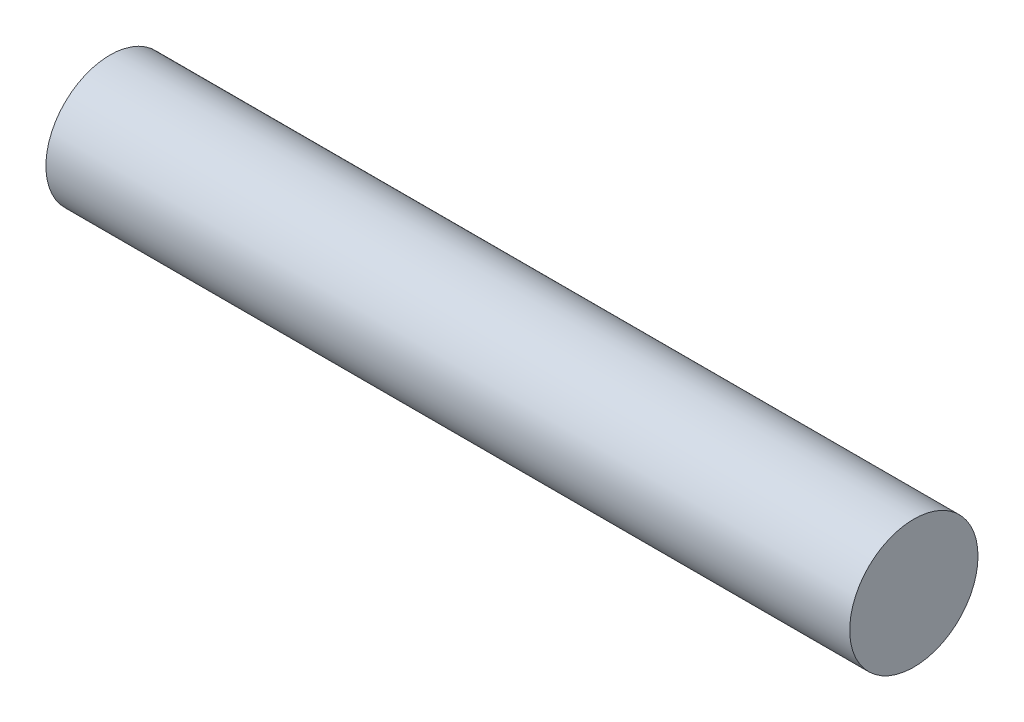
ISO-10303-21;
HEADER;
FILE_DESCRIPTION(('STEP AP214'),'2;1');
FILE_NAME('part.step','',(''),(''),'','','');
FILE_SCHEMA(('AUTOMOTIVE_DESIGN { 1 0 10303 214 1 1 1 1 }'));
ENDSEC;
DATA;
#1=APPLICATION_CONTEXT('core data for automotive mechanical design processes');
#2=APPLICATION_PROTOCOL_DEFINITION('international standard','automotive_design',2000,#1);
#3=PRODUCT_CONTEXT('',#1,'mechanical');
#4=PRODUCT('Part','Part','',(#3));
#5=PRODUCT_RELATED_PRODUCT_CATEGORY('part','',(#4));
#6=PRODUCT_DEFINITION_FORMATION('','',#4);
#7=PRODUCT_DEFINITION_CONTEXT('part definition',#1,'design');
#8=PRODUCT_DEFINITION('design','',#6,#7);
#9=PRODUCT_DEFINITION_SHAPE('','',#8);
#10=(LENGTH_UNIT() NAMED_UNIT(*) SI_UNIT(.MILLI.,.METRE.));
#11=(NAMED_UNIT(*) PLANE_ANGLE_UNIT() SI_UNIT($,.RADIAN.));
#12=(NAMED_UNIT(*) SI_UNIT($,.STERADIAN.) SOLID_ANGLE_UNIT());
#13=UNCERTAINTY_MEASURE_WITH_UNIT(LENGTH_MEASURE(1.E-05),#10,'distance_accuracy_value','');
#14=(GEOMETRIC_REPRESENTATION_CONTEXT(3) GLOBAL_UNCERTAINTY_ASSIGNED_CONTEXT((#13)) GLOBAL_UNIT_ASSIGNED_CONTEXT((#10,
#11,#12)) REPRESENTATION_CONTEXT('',''));
#15=CARTESIAN_POINT('',(0.,0.,0.));
#16=DIRECTION('',(0.,0.,1.));
#17=DIRECTION('',(1.,0.,0.));
#18=AXIS2_PLACEMENT_3D('',#15,#16,#17);
#19=CARTESIAN_POINT('',(25.,0.,0.));
#20=DIRECTION('',(-1.,0.,0.));
#21=DIRECTION('',(0.,0.,1.));
#22=AXIS2_PLACEMENT_3D('',#19,#20,#21);
#23=CYLINDRICAL_SURFACE('',#22,1.995);
#24=CARTESIAN_POINT('',(25.,0.,0.));
#25=DIRECTION('',(1.,0.,0.));
#26=DIRECTION('',(0.,0.,-1.));
#27=AXIS2_PLACEMENT_3D('',#24,#25,#26);
#28=CIRCLE('',#27,1.995);
#29=CARTESIAN_POINT('',(25.,0.,-1.995));
#30=VERTEX_POINT('',#29);
#31=EDGE_CURVE('E10',#30,#30,#28,.T.);
#32=ORIENTED_EDGE('',*,*,#31,.F.);
#33=EDGE_LOOP('',(#32));
#34=FACE_BOUND('',#33,.T.);
#35=CARTESIAN_POINT('',(0.,0.,0.));
#36=DIRECTION('',(1.,0.,0.));
#37=DIRECTION('',(0.,0.,-1.));
#38=AXIS2_PLACEMENT_3D('',#35,#36,#37);
#39=CIRCLE('',#38,1.995);
#40=CARTESIAN_POINT('',(0.,0.,-1.995));
#41=VERTEX_POINT('',#40);
#42=EDGE_CURVE('E40',#41,#41,#39,.T.);
#43=ORIENTED_EDGE('',*,*,#42,.T.);
#44=EDGE_LOOP('',(#43));
#45=FACE_BOUND('',#44,.T.);
#46=ADVANCED_FACE('F37',(#34,#45),#23,.T.);
#47=CARTESIAN_POINT('',(25.,0.,0.));
#48=DIRECTION('',(1.,0.,0.));
#49=DIRECTION('',(0.,0.,-1.));
#50=AXIS2_PLACEMENT_3D('',#47,#48,#49);
#51=PLANE('',#50);
#52=ORIENTED_EDGE('',*,*,#31,.T.);
#53=EDGE_LOOP('',(#52));
#54=FACE_BOUND('',#53,.T.);
#55=ADVANCED_FACE('F54',(#54),#51,.T.);
#56=CARTESIAN_POINT('',(0.,0.,0.));
#57=DIRECTION('',(1.,0.,0.));
#58=DIRECTION('',(0.,0.,-1.));
#59=AXIS2_PLACEMENT_3D('',#56,#57,#58);
#60=PLANE('',#59);
#61=ORIENTED_EDGE('',*,*,#42,.F.);
#62=EDGE_LOOP('',(#61));
#63=FACE_BOUND('',#62,.T.);
#64=ADVANCED_FACE('F52',(#63),#60,.F.);
#65=CLOSED_SHELL('',(#46,#55,#64));
#66=MANIFOLD_SOLID_BREP('B2',#65);
#67=ADVANCED_BREP_SHAPE_REPRESENTATION('',(#18,#66),#14);
#68=SHAPE_DEFINITION_REPRESENTATION(#9,#67);
ENDSEC;
END-ISO-10303-21;
